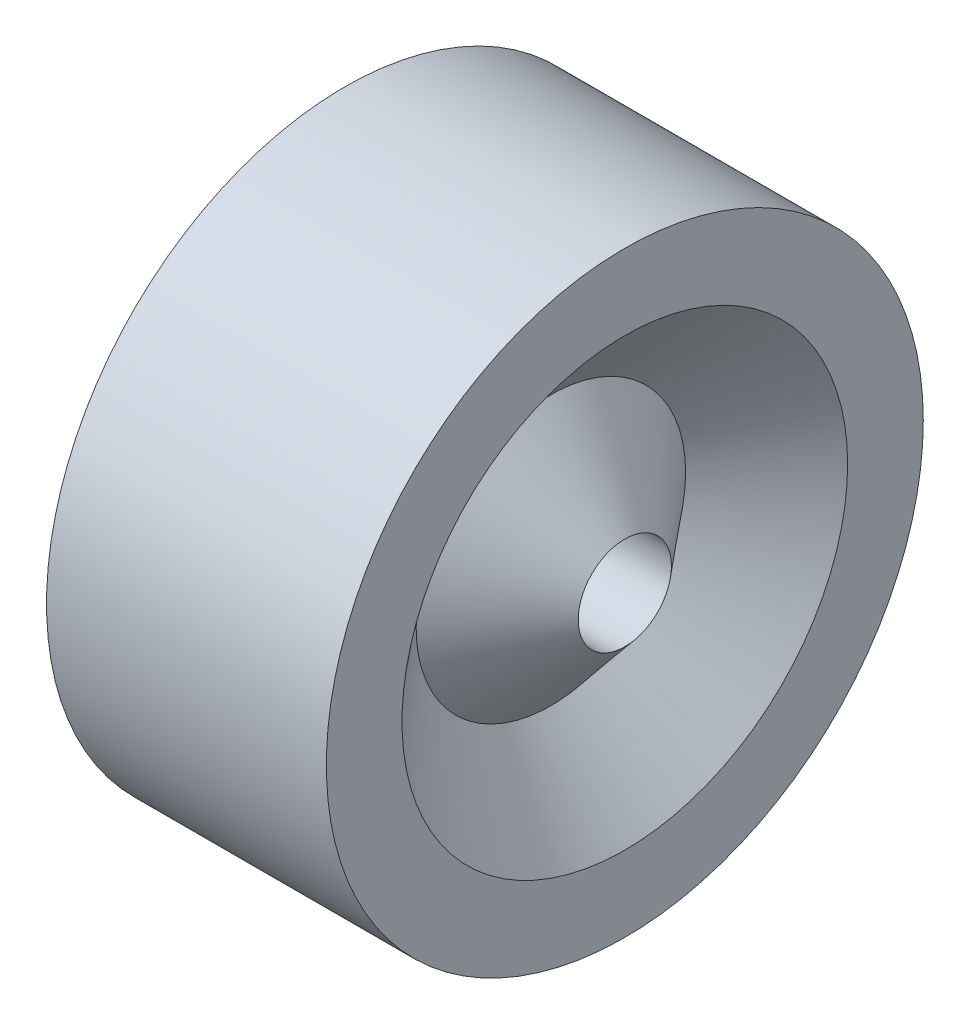
ISO-10303-21;
HEADER;
FILE_DESCRIPTION(('STEP AP214'),'2;1');
FILE_NAME('part.step','',(''),(''),'','','');
FILE_SCHEMA(('AUTOMOTIVE_DESIGN { 1 0 10303 214 1 1 1 1 }'));
ENDSEC;
DATA;
#1=APPLICATION_CONTEXT('core data for automotive mechanical design processes');
#2=APPLICATION_PROTOCOL_DEFINITION('international standard','automotive_design',2000,#1);
#3=PRODUCT_CONTEXT('',#1,'mechanical');
#4=PRODUCT('Part','Part','',(#3));
#5=PRODUCT_RELATED_PRODUCT_CATEGORY('part','',(#4));
#6=PRODUCT_DEFINITION_FORMATION('','',#4);
#7=PRODUCT_DEFINITION_CONTEXT('part definition',#1,'design');
#8=PRODUCT_DEFINITION('design','',#6,#7);
#9=PRODUCT_DEFINITION_SHAPE('','',#8);
#10=(LENGTH_UNIT() NAMED_UNIT(*) SI_UNIT(.MILLI.,.METRE.));
#11=(NAMED_UNIT(*) PLANE_ANGLE_UNIT() SI_UNIT($,.RADIAN.));
#12=(NAMED_UNIT(*) SI_UNIT($,.STERADIAN.) SOLID_ANGLE_UNIT());
#13=UNCERTAINTY_MEASURE_WITH_UNIT(LENGTH_MEASURE(1.E-05),#10,'distance_accuracy_value','');
#14=(GEOMETRIC_REPRESENTATION_CONTEXT(3) GLOBAL_UNCERTAINTY_ASSIGNED_CONTEXT((#13)) GLOBAL_UNIT_ASSIGNED_CONTEXT((#10,
#11,#12)) REPRESENTATION_CONTEXT('',''));
#15=CARTESIAN_POINT('',(0.,0.,0.));
#16=DIRECTION('',(0.,0.,1.));
#17=DIRECTION('',(1.,0.,0.));
#18=AXIS2_PLACEMENT_3D('',#15,#16,#17);
#19=CARTESIAN_POINT('',(30.,0.,0.));
#20=DIRECTION('',(1.,0.,0.));
#21=DIRECTION('',(0.,0.,-1.));
#22=AXIS2_PLACEMENT_3D('',#19,#20,#21);
#23=PLANE('',#22);
#24=CARTESIAN_POINT('',(30.,0.,0.));
#25=DIRECTION('',(1.,0.,0.));
#26=DIRECTION('',(0.,0.,-1.));
#27=AXIS2_PLACEMENT_3D('',#24,#25,#26);
#28=CIRCLE('',#27,23.8906542847891);
#29=CARTESIAN_POINT('',(30.,0.,-23.8906542847891));
#30=VERTEX_POINT('',#29);
#31=EDGE_CURVE('E51',#30,#30,#28,.T.);
#32=ORIENTED_EDGE('',*,*,#31,.F.);
#33=EDGE_LOOP('',(#32));
#34=FACE_BOUND('',#33,.T.);
#35=CARTESIAN_POINT('',(30.,0.,0.));
#36=DIRECTION('',(1.,0.,0.));
#37=DIRECTION('',(0.,0.,-1.));
#38=AXIS2_PLACEMENT_3D('',#35,#36,#37);
#39=CIRCLE('',#38,32.);
#40=CARTESIAN_POINT('',(30.,0.,-32.));
#41=VERTEX_POINT('',#40);
#42=EDGE_CURVE('E10',#41,#41,#39,.T.);
#43=ORIENTED_EDGE('',*,*,#42,.T.);
#44=EDGE_LOOP('',(#43));
#45=FACE_BOUND('',#44,.T.);
#46=ADVANCED_FACE('F33',(#34,#45),#23,.T.);
#47=CARTESIAN_POINT('',(0.,0.,0.));
#48=DIRECTION('',(1.,0.,0.));
#49=DIRECTION('',(0.,0.,-1.));
#50=AXIS2_PLACEMENT_3D('',#47,#48,#49);
#51=PLANE('',#50);
#52=CARTESIAN_POINT('',(0.,0.,0.));
#53=DIRECTION('',(1.,0.,0.));
#54=DIRECTION('',(0.,0.,-1.));
#55=AXIS2_PLACEMENT_3D('',#52,#53,#54);
#56=CIRCLE('',#55,32.);
#57=CARTESIAN_POINT('',(0.,0.,-32.));
#58=VERTEX_POINT('',#57);
#59=EDGE_CURVE('E37',#58,#58,#56,.T.);
#60=ORIENTED_EDGE('',*,*,#59,.F.);
#61=EDGE_LOOP('',(#60));
#62=FACE_BOUND('',#61,.T.);
#63=CARTESIAN_POINT('',(0.,0.,0.));
#64=DIRECTION('',(1.,0.,0.));
#65=DIRECTION('',(0.,0.,-1.));
#66=AXIS2_PLACEMENT_3D('',#63,#64,#65);
#67=CIRCLE('',#66,5.);
#68=CARTESIAN_POINT('',(0.,0.,-5.));
#69=VERTEX_POINT('',#68);
#70=EDGE_CURVE('E44',#69,#69,#67,.T.);
#71=ORIENTED_EDGE('',*,*,#70,.T.);
#72=EDGE_LOOP('',(#71));
#73=FACE_BOUND('',#72,.T.);
#74=ADVANCED_FACE('F72',(#62,#73),#51,.F.);
#75=CARTESIAN_POINT('',(30.,0.,0.));
#76=DIRECTION('',(-1.,0.,0.));
#77=DIRECTION('',(0.,0.,1.));
#78=AXIS2_PLACEMENT_3D('',#75,#76,#77);
#79=CYLINDRICAL_SURFACE('',#78,32.);
#80=ORIENTED_EDGE('',*,*,#42,.F.);
#81=EDGE_LOOP('',(#80));
#82=FACE_BOUND('',#81,.T.);
#83=ORIENTED_EDGE('',*,*,#59,.T.);
#84=EDGE_LOOP('',(#83));
#85=FACE_BOUND('',#84,.T.);
#86=ADVANCED_FACE('F35',(#82,#85),#79,.T.);
#87=CARTESIAN_POINT('',(30.,0.,0.));
#88=DIRECTION('',(-1.,0.,0.));
#89=DIRECTION('',(0.,0.,1.));
#90=AXIS2_PLACEMENT_3D('',#87,#88,#89);
#91=CYLINDRICAL_SURFACE('',#90,5.);
#92=CARTESIAN_POINT('',(30.,0.,0.));
#93=DIRECTION('',(1.,0.,0.));
#94=DIRECTION('',(0.,0.,-1.));
#95=AXIS2_PLACEMENT_3D('',#92,#93,#94);
#96=CIRCLE('',#95,5.);
#97=CARTESIAN_POINT('',(30.,0.,-5.));
#98=VERTEX_POINT('',#97);
#99=EDGE_CURVE('E54',#98,#98,#96,.T.);
#100=ORIENTED_EDGE('',*,*,#99,.T.);
#101=EDGE_LOOP('',(#100));
#102=FACE_BOUND('',#101,.T.);
#103=ORIENTED_EDGE('',*,*,#70,.F.);
#104=EDGE_LOOP('',(#103));
#105=FACE_BOUND('',#104,.T.);
#106=ADVANCED_FACE('F58',(#102,#105),#91,.F.);
#107=CARTESIAN_POINT('',(30.,0.,0.));
#108=DIRECTION('',(1.,0.,0.));
#109=DIRECTION('',(0.,0.,-1.));
#110=AXIS2_PLACEMENT_3D('',#107,#108,#109);
#111=CONICAL_SURFACE('',#110,23.8906542847891,0.872664625997167);
#112=ORIENTED_EDGE('',*,*,#31,.T.);
#113=EDGE_LOOP('',(#112));
#114=FACE_BOUND('',#113,.T.);
#115=CARTESIAN_POINT('',(22.074429478468,0.,0.));
#116=DIRECTION('',(1.,0.,0.));
#117=DIRECTION('',(0.,0.,-1.));
#118=AXIS2_PLACEMENT_3D('',#115,#116,#117);
#119=CIRCLE('',#118,14.4453271423945);
#120=CARTESIAN_POINT('',(22.074429478468,0.,-14.4453271423945));
#121=VERTEX_POINT('',#120);
#122=EDGE_CURVE('E48',#121,#121,#119,.T.);
#123=ORIENTED_EDGE('',*,*,#122,.F.);
#124=EDGE_LOOP('',(#123));
#125=FACE_BOUND('',#124,.T.);
#126=ADVANCED_FACE('F63',(#114,#125),#111,.F.);
#127=CARTESIAN_POINT('',(30.,0.,0.));
#128=DIRECTION('',(-1.,0.,0.));
#129=DIRECTION('',(0.,0.,-1.));
#130=AXIS2_PLACEMENT_3D('',#127,#128,#129);
#131=CONICAL_SURFACE('',#130,5.,0.872664625997167);
#132=ORIENTED_EDGE('',*,*,#122,.T.);
#133=EDGE_LOOP('',(#132));
#134=FACE_BOUND('',#133,.T.);
#135=ORIENTED_EDGE('',*,*,#99,.F.);
#136=EDGE_LOOP('',(#135));
#137=FACE_BOUND('',#136,.T.);
#138=ADVANCED_FACE('F61',(#134,#137),#131,.T.);
#139=CLOSED_SHELL('',(#46,#74,#86,#106,#126,#138));
#140=MANIFOLD_SOLID_BREP('B2',#139);
#141=ADVANCED_BREP_SHAPE_REPRESENTATION('',(#18,#140),#14);
#142=SHAPE_DEFINITION_REPRESENTATION(#9,#141);
ENDSEC;
END-ISO-10303-21;
